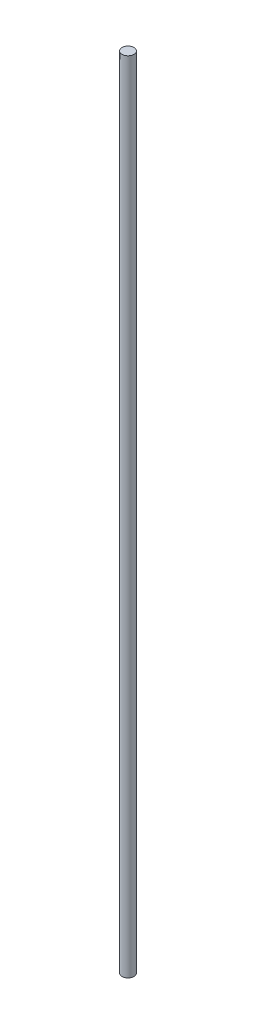
ISO-10303-21;
HEADER;
FILE_DESCRIPTION(('STEP AP214'),'2;1');
FILE_NAME('part.step','',(''),(''),'','','');
FILE_SCHEMA(('AUTOMOTIVE_DESIGN { 1 0 10303 214 1 1 1 1 }'));
ENDSEC;
DATA;
#1=APPLICATION_CONTEXT('core data for automotive mechanical design processes');
#2=APPLICATION_PROTOCOL_DEFINITION('international standard','automotive_design',2000,#1);
#3=PRODUCT_CONTEXT('',#1,'mechanical');
#4=PRODUCT('Part','Part','',(#3));
#5=PRODUCT_RELATED_PRODUCT_CATEGORY('part','',(#4));
#6=PRODUCT_DEFINITION_FORMATION('','',#4);
#7=PRODUCT_DEFINITION_CONTEXT('part definition',#1,'design');
#8=PRODUCT_DEFINITION('design','',#6,#7);
#9=PRODUCT_DEFINITION_SHAPE('','',#8);
#10=(LENGTH_UNIT() NAMED_UNIT(*) SI_UNIT(.MILLI.,.METRE.));
#11=(NAMED_UNIT(*) PLANE_ANGLE_UNIT() SI_UNIT($,.RADIAN.));
#12=(NAMED_UNIT(*) SI_UNIT($,.STERADIAN.) SOLID_ANGLE_UNIT());
#13=UNCERTAINTY_MEASURE_WITH_UNIT(LENGTH_MEASURE(1.E-05),#10,'distance_accuracy_value','');
#14=(GEOMETRIC_REPRESENTATION_CONTEXT(3) GLOBAL_UNCERTAINTY_ASSIGNED_CONTEXT((#13)) GLOBAL_UNIT_ASSIGNED_CONTEXT((#10,
#11,#12)) REPRESENTATION_CONTEXT('',''));
#15=CARTESIAN_POINT('',(0.,0.,0.));
#16=DIRECTION('',(0.,0.,1.));
#17=DIRECTION('',(1.,0.,0.));
#18=AXIS2_PLACEMENT_3D('',#15,#16,#17);
#19=CARTESIAN_POINT('',(0.,200.,0.));
#20=DIRECTION('',(0.,-1.,0.));
#21=DIRECTION('',(0.,0.,-1.));
#22=AXIS2_PLACEMENT_3D('',#19,#20,#21);
#23=CYLINDRICAL_SURFACE('',#22,1.5);
#24=CARTESIAN_POINT('',(0.,200.,0.));
#25=DIRECTION('',(0.,1.,0.));
#26=DIRECTION('',(0.,0.,1.));
#27=AXIS2_PLACEMENT_3D('',#24,#25,#26);
#28=CIRCLE('',#27,1.5);
#29=CARTESIAN_POINT('',(0.,200.,1.5));
#30=VERTEX_POINT('',#29);
#31=EDGE_CURVE('E10',#30,#30,#28,.T.);
#32=ORIENTED_EDGE('',*,*,#31,.F.);
#33=EDGE_LOOP('',(#32));
#34=FACE_BOUND('',#33,.T.);
#35=CARTESIAN_POINT('',(0.,0.,0.));
#36=DIRECTION('',(0.,1.,0.));
#37=DIRECTION('',(0.,0.,1.));
#38=AXIS2_PLACEMENT_3D('',#35,#36,#37);
#39=CIRCLE('',#38,1.5);
#40=CARTESIAN_POINT('',(0.,0.,1.5));
#41=VERTEX_POINT('',#40);
#42=EDGE_CURVE('E46',#41,#41,#39,.T.);
#43=ORIENTED_EDGE('',*,*,#42,.T.);
#44=EDGE_LOOP('',(#43));
#45=FACE_BOUND('',#44,.T.);
#46=ADVANCED_FACE('F43',(#34,#45),#23,.T.);
#47=CARTESIAN_POINT('',(0.,200.,0.));
#48=DIRECTION('',(0.,1.,0.));
#49=DIRECTION('',(0.,0.,1.));
#50=AXIS2_PLACEMENT_3D('',#47,#48,#49);
#51=PLANE('',#50);
#52=ORIENTED_EDGE('',*,*,#31,.T.);
#53=EDGE_LOOP('',(#52));
#54=FACE_BOUND('',#53,.T.);
#55=ADVANCED_FACE('F58',(#54),#51,.T.);
#56=CARTESIAN_POINT('',(0.,0.,0.));
#57=DIRECTION('',(0.,1.,0.));
#58=DIRECTION('',(0.,0.,1.));
#59=AXIS2_PLACEMENT_3D('',#56,#57,#58);
#60=PLANE('',#59);
#61=ORIENTED_EDGE('',*,*,#42,.F.);
#62=EDGE_LOOP('',(#61));
#63=FACE_BOUND('',#62,.T.);
#64=ADVANCED_FACE('F59',(#63),#60,.F.);
#65=CLOSED_SHELL('',(#46,#55,#64));
#66=MANIFOLD_SOLID_BREP('B2',#65);
#67=ADVANCED_BREP_SHAPE_REPRESENTATION('',(#18,#66),#14);
#68=SHAPE_DEFINITION_REPRESENTATION(#9,#67);
ENDSEC;
END-ISO-10303-21;
